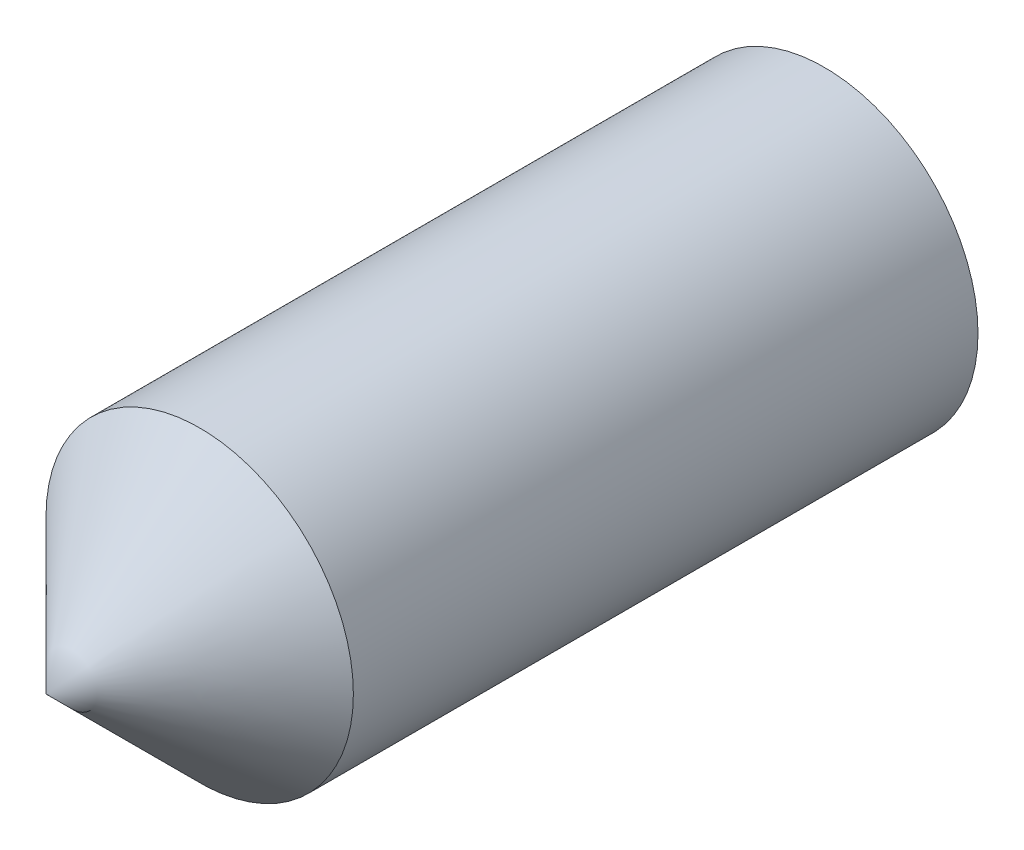
ISO-10303-21;
HEADER;
FILE_DESCRIPTION(('STEP AP214'),'2;1');
FILE_NAME('part.step','',(''),(''),'','','');
FILE_SCHEMA(('AUTOMOTIVE_DESIGN { 1 0 10303 214 1 1 1 1 }'));
ENDSEC;
DATA;
#1=APPLICATION_CONTEXT('core data for automotive mechanical design processes');
#2=APPLICATION_PROTOCOL_DEFINITION('international standard','automotive_design',2000,#1);
#3=PRODUCT_CONTEXT('',#1,'mechanical');
#4=PRODUCT('Part','Part','',(#3));
#5=PRODUCT_RELATED_PRODUCT_CATEGORY('part','',(#4));
#6=PRODUCT_DEFINITION_FORMATION('','',#4);
#7=PRODUCT_DEFINITION_CONTEXT('part definition',#1,'design');
#8=PRODUCT_DEFINITION('design','',#6,#7);
#9=PRODUCT_DEFINITION_SHAPE('','',#8);
#10=(LENGTH_UNIT() NAMED_UNIT(*) SI_UNIT(.MILLI.,.METRE.));
#11=(NAMED_UNIT(*) PLANE_ANGLE_UNIT() SI_UNIT($,.RADIAN.));
#12=(NAMED_UNIT(*) SI_UNIT($,.STERADIAN.) SOLID_ANGLE_UNIT());
#13=UNCERTAINTY_MEASURE_WITH_UNIT(LENGTH_MEASURE(1.E-05),#10,'distance_accuracy_value','');
#14=(GEOMETRIC_REPRESENTATION_CONTEXT(3) GLOBAL_UNCERTAINTY_ASSIGNED_CONTEXT((#13)) GLOBAL_UNIT_ASSIGNED_CONTEXT((#10,
#11,#12)) REPRESENTATION_CONTEXT('',''));
#15=CARTESIAN_POINT('',(0.,0.,0.));
#16=DIRECTION('',(0.,0.,1.));
#17=DIRECTION('',(1.,0.,0.));
#18=AXIS2_PLACEMENT_3D('',#15,#16,#17);
#19=CARTESIAN_POINT('',(0.,33.5,40.));
#20=DIRECTION('',(0.,0.,1.));
#21=DIRECTION('',(1.,0.,0.));
#22=AXIS2_PLACEMENT_3D('',#19,#20,#21);
#23=PLANE('',#22);
#24=CARTESIAN_POINT('',(0.,33.5,40.));
#25=DIRECTION('',(0.,0.,-1.));
#26=DIRECTION('',(-1.,0.,0.));
#27=AXIS2_PLACEMENT_3D('',#24,#25,#26);
#28=CIRCLE('',#27,9.84228285053895);
#29=CARTESIAN_POINT('',(-9.84228285053895,33.5,40.));
#30=VERTEX_POINT('',#29);
#31=EDGE_CURVE('E43',#30,#30,#28,.T.);
#32=ORIENTED_EDGE('',*,*,#31,.T.);
#33=EDGE_LOOP('',(#32));
#34=FACE_BOUND('',#33,.T.);
#35=ADVANCED_FACE('F37',(#34),#23,.F.);
#36=CARTESIAN_POINT('',(0.,33.5,89.8423298200371));
#37=DIRECTION('',(0.,0.,-1.));
#38=DIRECTION('',(-1.,0.,0.));
#39=AXIS2_PLACEMENT_3D('',#36,#37,#38);
#40=CONICAL_SURFACE('',#39,0.,0.78539816339744);
#41=CARTESIAN_POINT('',(0.,33.5,80.000046969498));
#42=DIRECTION('',(0.,0.,-1.));
#43=DIRECTION('',(-1.,0.,0.));
#44=AXIS2_PLACEMENT_3D('',#41,#42,#43);
#45=CIRCLE('',#44,9.84228285053895);
#46=CARTESIAN_POINT('',(-9.84228285053895,33.5,80.000046969498));
#47=VERTEX_POINT('',#46);
#48=EDGE_CURVE('E11',#47,#47,#45,.T.);
#49=ORIENTED_EDGE('',*,*,#48,.F.);
#50=EDGE_LOOP('',(#49));
#51=FACE_BOUND('',#50,.T.);
#52=CARTESIAN_POINT('',(0.,33.5,89.8423298200371));
#53=VERTEX_POINT('',#52);
#54=VERTEX_LOOP('',#53);
#55=FACE_BOUND('',#54,.T.);
#56=ADVANCED_FACE('F46',(#51,#55),#40,.T.);
#57=CARTESIAN_POINT('',(0.,33.5,40.));
#58=DIRECTION('',(0.,0.,-1.));
#59=DIRECTION('',(-1.,0.,0.));
#60=AXIS2_PLACEMENT_3D('',#57,#58,#59);
#61=CYLINDRICAL_SURFACE('',#60,9.84228285053895);
#62=ORIENTED_EDGE('',*,*,#31,.F.);
#63=EDGE_LOOP('',(#62));
#64=FACE_BOUND('',#63,.T.);
#65=ORIENTED_EDGE('',*,*,#48,.T.);
#66=EDGE_LOOP('',(#65));
#67=FACE_BOUND('',#66,.T.);
#68=ADVANCED_FACE('F48',(#64,#67),#61,.T.);
#69=CLOSED_SHELL('',(#35,#56,#68));
#70=MANIFOLD_SOLID_BREP('B2',#69);
#71=ADVANCED_BREP_SHAPE_REPRESENTATION('',(#18,#70),#14);
#72=SHAPE_DEFINITION_REPRESENTATION(#9,#71);
ENDSEC;
END-ISO-10303-21;
